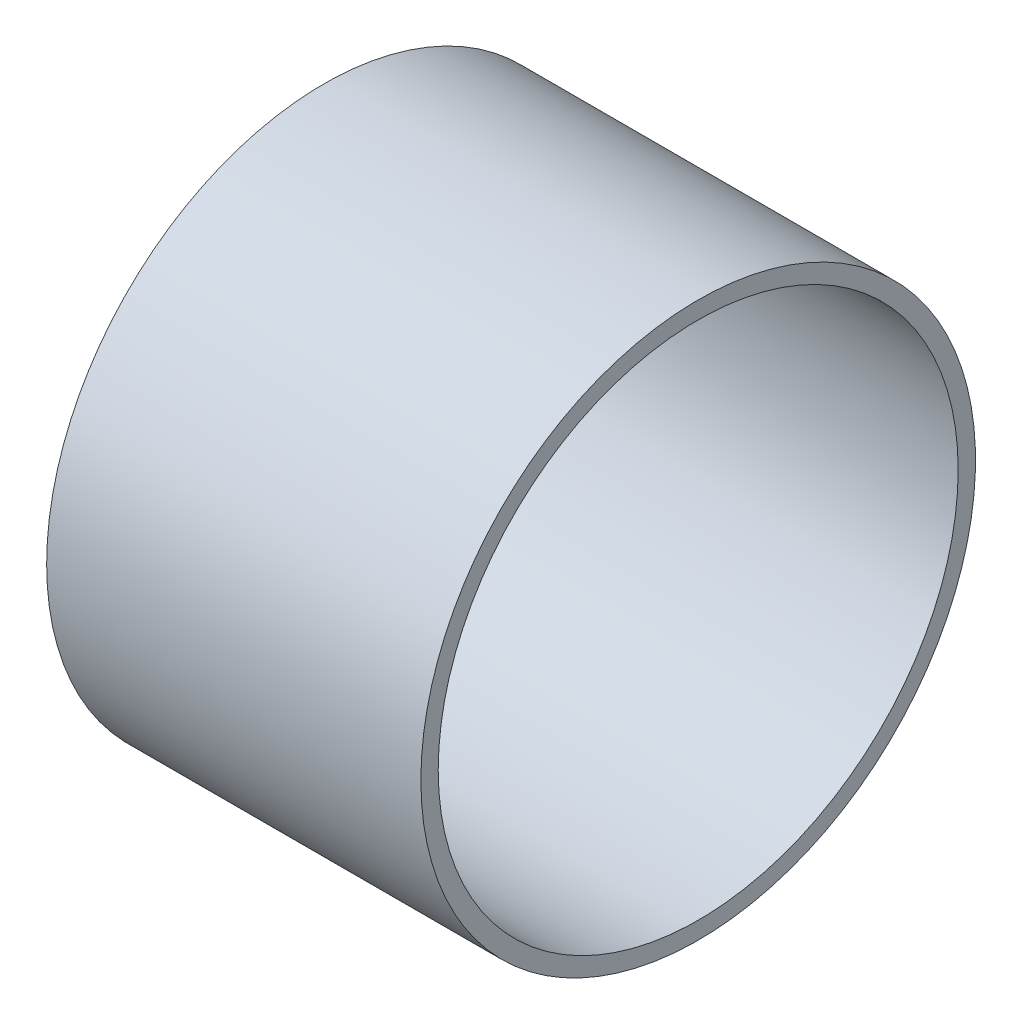
ISO-10303-21;
HEADER;
FILE_DESCRIPTION(('STEP AP214'),'2;1');
FILE_NAME('part.step','',(''),(''),'','','');
FILE_SCHEMA(('AUTOMOTIVE_DESIGN { 1 0 10303 214 1 1 1 1 }'));
ENDSEC;
DATA;
#1=APPLICATION_CONTEXT('core data for automotive mechanical design processes');
#2=APPLICATION_PROTOCOL_DEFINITION('international standard','automotive_design',2000,#1);
#3=PRODUCT_CONTEXT('',#1,'mechanical');
#4=PRODUCT('Part','Part','',(#3));
#5=PRODUCT_RELATED_PRODUCT_CATEGORY('part','',(#4));
#6=PRODUCT_DEFINITION_FORMATION('','',#4);
#7=PRODUCT_DEFINITION_CONTEXT('part definition',#1,'design');
#8=PRODUCT_DEFINITION('design','',#6,#7);
#9=PRODUCT_DEFINITION_SHAPE('','',#8);
#10=(LENGTH_UNIT() NAMED_UNIT(*) SI_UNIT(.MILLI.,.METRE.));
#11=(NAMED_UNIT(*) PLANE_ANGLE_UNIT() SI_UNIT($,.RADIAN.));
#12=(NAMED_UNIT(*) SI_UNIT($,.STERADIAN.) SOLID_ANGLE_UNIT());
#13=UNCERTAINTY_MEASURE_WITH_UNIT(LENGTH_MEASURE(1.E-05),#10,'distance_accuracy_value','');
#14=(GEOMETRIC_REPRESENTATION_CONTEXT(3) GLOBAL_UNCERTAINTY_ASSIGNED_CONTEXT((#13)) GLOBAL_UNIT_ASSIGNED_CONTEXT((#10,
#11,#12)) REPRESENTATION_CONTEXT('',''));
#15=CARTESIAN_POINT('',(0.,0.,0.));
#16=DIRECTION('',(0.,0.,1.));
#17=DIRECTION('',(1.,0.,0.));
#18=AXIS2_PLACEMENT_3D('',#15,#16,#17);
#19=CARTESIAN_POINT('',(167.4495,0.,0.));
#20=DIRECTION('',(-1.,0.,0.));
#21=DIRECTION('',(0.,0.,1.));
#22=AXIS2_PLACEMENT_3D('',#19,#20,#21);
#23=CYLINDRICAL_SURFACE('',#22,25.4);
#24=CARTESIAN_POINT('',(-133.1755,0.,0.));
#25=DIRECTION('',(-1.,0.,0.));
#26=DIRECTION('',(0.,0.,1.));
#27=AXIS2_PLACEMENT_3D('',#24,#25,#26);
#28=CIRCLE('',#27,25.4);
#29=CARTESIAN_POINT('',(-133.1755,0.,25.4));
#30=VERTEX_POINT('',#29);
#31=EDGE_CURVE('E47',#30,#30,#28,.T.);
#32=ORIENTED_EDGE('',*,*,#31,.T.);
#33=EDGE_LOOP('',(#32));
#34=FACE_BOUND('',#33,.T.);
#35=CARTESIAN_POINT('',(-167.4495,0.,0.));
#36=DIRECTION('',(1.,0.,0.));
#37=DIRECTION('',(0.,0.,-1.));
#38=AXIS2_PLACEMENT_3D('',#35,#36,#37);
#39=CIRCLE('',#38,25.4);
#40=CARTESIAN_POINT('',(-167.4495,0.,-25.4));
#41=VERTEX_POINT('',#40);
#42=EDGE_CURVE('E10',#41,#41,#39,.T.);
#43=ORIENTED_EDGE('',*,*,#42,.T.);
#44=EDGE_LOOP('',(#43));
#45=FACE_BOUND('',#44,.T.);
#46=ADVANCED_FACE('F36',(#34,#45),#23,.T.);
#47=CARTESIAN_POINT('',(-167.4495,0.,0.));
#48=DIRECTION('',(1.,0.,0.));
#49=DIRECTION('',(0.,0.,-1.));
#50=AXIS2_PLACEMENT_3D('',#47,#48,#49);
#51=PLANE('',#50);
#52=ORIENTED_EDGE('',*,*,#42,.F.);
#53=EDGE_LOOP('',(#52));
#54=FACE_BOUND('',#53,.T.);
#55=CARTESIAN_POINT('',(-167.4495,0.,0.));
#56=DIRECTION('',(1.,0.,0.));
#57=DIRECTION('',(0.,0.,-1.));
#58=AXIS2_PLACEMENT_3D('',#55,#56,#57);
#59=CIRCLE('',#58,23.8125);
#60=CARTESIAN_POINT('',(-167.4495,0.,-23.8125));
#61=VERTEX_POINT('',#60);
#62=EDGE_CURVE('E43',#61,#61,#59,.T.);
#63=ORIENTED_EDGE('',*,*,#62,.T.);
#64=EDGE_LOOP('',(#63));
#65=FACE_BOUND('',#64,.T.);
#66=ADVANCED_FACE('F62',(#54,#65),#51,.F.);
#67=CARTESIAN_POINT('',(167.4495,0.,0.));
#68=DIRECTION('',(-1.,0.,0.));
#69=DIRECTION('',(0.,0.,1.));
#70=AXIS2_PLACEMENT_3D('',#67,#68,#69);
#71=CYLINDRICAL_SURFACE('',#70,23.8125);
#72=CARTESIAN_POINT('',(-133.1755,0.,0.));
#73=DIRECTION('',(-1.,0.,0.));
#74=DIRECTION('',(0.,0.,1.));
#75=AXIS2_PLACEMENT_3D('',#72,#73,#74);
#76=CIRCLE('',#75,23.8125);
#77=CARTESIAN_POINT('',(-133.1755,0.,23.8125));
#78=VERTEX_POINT('',#77);
#79=EDGE_CURVE('E39',#78,#78,#76,.T.);
#80=ORIENTED_EDGE('',*,*,#79,.F.);
#81=EDGE_LOOP('',(#80));
#82=FACE_BOUND('',#81,.T.);
#83=ORIENTED_EDGE('',*,*,#62,.F.);
#84=EDGE_LOOP('',(#83));
#85=FACE_BOUND('',#84,.T.);
#86=ADVANCED_FACE('F59',(#82,#85),#71,.F.);
#87=CARTESIAN_POINT('',(-133.1755,-25.4,-25.4));
#88=DIRECTION('',(-1.,0.,0.));
#89=DIRECTION('',(0.,0.,1.));
#90=AXIS2_PLACEMENT_3D('',#87,#88,#89);
#91=PLANE('',#90);
#92=ORIENTED_EDGE('',*,*,#79,.T.);
#93=EDGE_LOOP('',(#92));
#94=FACE_BOUND('',#93,.T.);
#95=ORIENTED_EDGE('',*,*,#31,.F.);
#96=EDGE_LOOP('',(#95));
#97=FACE_BOUND('',#96,.T.);
#98=ADVANCED_FACE('F56',(#94,#97),#91,.F.);
#99=CLOSED_SHELL('',(#46,#66,#86,#98));
#100=MANIFOLD_SOLID_BREP('B2',#99);
#101=ADVANCED_BREP_SHAPE_REPRESENTATION('',(#18,#100),#14);
#102=SHAPE_DEFINITION_REPRESENTATION(#9,#101);
ENDSEC;
END-ISO-10303-21;
